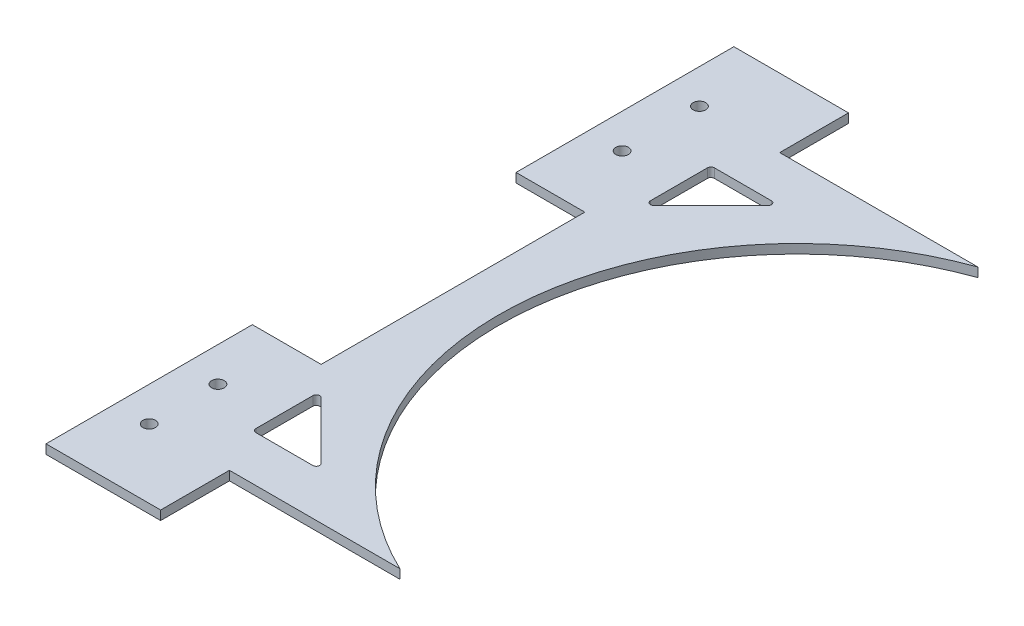
ISO-10303-21;
HEADER;
FILE_DESCRIPTION(('STEP AP214'),'2;1');
FILE_NAME('part.step','',(''),(''),'','','');
FILE_SCHEMA(('AUTOMOTIVE_DESIGN { 1 0 10303 214 1 1 1 1 }'));
ENDSEC;
DATA;
#1=APPLICATION_CONTEXT('core data for automotive mechanical design processes');
#2=APPLICATION_PROTOCOL_DEFINITION('international standard','automotive_design',2000,#1);
#3=PRODUCT_CONTEXT('',#1,'mechanical');
#4=PRODUCT('Part','Part','',(#3));
#5=PRODUCT_RELATED_PRODUCT_CATEGORY('part','',(#4));
#6=PRODUCT_DEFINITION_FORMATION('','',#4);
#7=PRODUCT_DEFINITION_CONTEXT('part definition',#1,'design');
#8=PRODUCT_DEFINITION('design','',#6,#7);
#9=PRODUCT_DEFINITION_SHAPE('','',#8);
#10=(LENGTH_UNIT() NAMED_UNIT(*) SI_UNIT(.MILLI.,.METRE.));
#11=(NAMED_UNIT(*) PLANE_ANGLE_UNIT() SI_UNIT($,.RADIAN.));
#12=(NAMED_UNIT(*) SI_UNIT($,.STERADIAN.) SOLID_ANGLE_UNIT());
#13=UNCERTAINTY_MEASURE_WITH_UNIT(LENGTH_MEASURE(1.E-05),#10,'distance_accuracy_value','');
#14=(GEOMETRIC_REPRESENTATION_CONTEXT(3) GLOBAL_UNCERTAINTY_ASSIGNED_CONTEXT((#13)) GLOBAL_UNIT_ASSIGNED_CONTEXT((#10,
#11,#12)) REPRESENTATION_CONTEXT('',''));
#15=CARTESIAN_POINT('',(0.,0.,0.));
#16=DIRECTION('',(0.,0.,1.));
#17=DIRECTION('',(1.,0.,0.));
#18=AXIS2_PLACEMENT_3D('',#15,#16,#17);
#19=CARTESIAN_POINT('',(0.,4.,0.));
#20=DIRECTION('',(0.,-1.,0.));
#21=DIRECTION('',(0.,0.,-1.));
#22=AXIS2_PLACEMENT_3D('',#19,#20,#21);
#23=PLANE('',#22);
#24=DIRECTION('',(1.,0.,0.));
#25=VECTOR('',#24,1.);
#26=CARTESIAN_POINT('',(0.,4.,270.));
#27=LINE('',#26,#25);
#28=CARTESIAN_POINT('',(50.,4.,270.));
#29=VERTEX_POINT('',#28);
#30=CARTESIAN_POINT('',(124.378511346782,4.,270.));
#31=VERTEX_POINT('',#30);
#32=EDGE_CURVE('E43',#29,#31,#27,.T.);
#33=ORIENTED_EDGE('',*,*,#32,.T.);
#34=CARTESIAN_POINT('',(180.,4.,152.5));
#35=DIRECTION('',(0.,1.,0.));
#36=DIRECTION('',(0.,0.,1.));
#37=AXIS2_PLACEMENT_3D('',#34,#35,#36);
#38=CIRCLE('',#37,130.);
#39=CARTESIAN_POINT('',(136.482762036177,4.,30.));
#40=VERTEX_POINT('',#39);
#41=EDGE_CURVE('E48',#40,#31,#38,.T.);
#42=ORIENTED_EDGE('',*,*,#41,.F.);
#43=DIRECTION('',(1.,0.,0.));
#44=VECTOR('',#43,1.);
#45=CARTESIAN_POINT('',(0.,4.,30.));
#46=LINE('',#45,#44);
#47=CARTESIAN_POINT('',(50.,4.,30.));
#48=VERTEX_POINT('',#47);
#49=EDGE_CURVE('E356',#48,#40,#46,.T.);
#50=ORIENTED_EDGE('',*,*,#49,.F.);
#51=DIRECTION('',(0.,0.,1.));
#52=VECTOR('',#51,1.);
#53=CARTESIAN_POINT('',(50.,4.,0.));
#54=LINE('',#53,#52);
#55=CARTESIAN_POINT('',(50.,4.,0.));
#56=VERTEX_POINT('',#55);
#57=EDGE_CURVE('E344',#56,#48,#54,.T.);
#58=ORIENTED_EDGE('',*,*,#57,.F.);
#59=DIRECTION('',(-1.,0.,0.));
#60=VECTOR('',#59,1.);
#61=CARTESIAN_POINT('',(0.,4.,0.));
#62=LINE('',#61,#60);
#63=CARTESIAN_POINT('',(0.,4.,0.));
#64=VERTEX_POINT('',#63);
#65=EDGE_CURVE('E340',#56,#64,#62,.T.);
#66=ORIENTED_EDGE('',*,*,#65,.T.);
#67=DIRECTION('',(0.,0.,1.));
#68=VECTOR('',#67,1.);
#69=CARTESIAN_POINT('',(0.,4.,300.));
#70=LINE('',#69,#68);
#71=CARTESIAN_POINT('',(0.,4.,95.));
#72=VERTEX_POINT('',#71);
#73=EDGE_CURVE('E336',#64,#72,#70,.T.);
#74=ORIENTED_EDGE('',*,*,#73,.T.);
#75=DIRECTION('',(1.,0.,0.));
#76=VECTOR('',#75,1.);
#77=CARTESIAN_POINT('',(0.,4.,95.));
#78=LINE('',#77,#76);
#79=CARTESIAN_POINT('',(30.,4.,95.));
#80=VERTEX_POINT('',#79);
#81=EDGE_CURVE('E339',#72,#80,#78,.T.);
#82=ORIENTED_EDGE('',*,*,#81,.T.);
#83=DIRECTION('',(0.,0.,1.));
#84=VECTOR('',#83,1.);
#85=CARTESIAN_POINT('',(30.,4.,0.));
#86=LINE('',#85,#84);
#87=CARTESIAN_POINT('',(30.,4.,210.));
#88=VERTEX_POINT('',#87);
#89=EDGE_CURVE('E379',#80,#88,#86,.T.);
#90=ORIENTED_EDGE('',*,*,#89,.T.);
#91=DIRECTION('',(-1.,0.,0.));
#92=VECTOR('',#91,1.);
#93=CARTESIAN_POINT('',(0.,4.,210.));
#94=LINE('',#93,#92);
#95=CARTESIAN_POINT('',(0.,4.,210.));
#96=VERTEX_POINT('',#95);
#97=EDGE_CURVE('E376',#88,#96,#94,.T.);
#98=ORIENTED_EDGE('',*,*,#97,.T.);
#99=CARTESIAN_POINT('',(0.,4.,300.));
#100=VERTEX_POINT('',#99);
#101=EDGE_CURVE('E341',#96,#100,#70,.T.);
#102=ORIENTED_EDGE('',*,*,#101,.T.);
#103=DIRECTION('',(1.,0.,0.));
#104=VECTOR('',#103,1.);
#105=CARTESIAN_POINT('',(360.,4.,300.));
#106=LINE('',#105,#104);
#107=CARTESIAN_POINT('',(50.,4.,300.));
#108=VERTEX_POINT('',#107);
#109=EDGE_CURVE('E394',#100,#108,#106,.T.);
#110=ORIENTED_EDGE('',*,*,#109,.T.);
#111=DIRECTION('',(0.,0.,1.));
#112=VECTOR('',#111,1.);
#113=CARTESIAN_POINT('',(50.,4.,0.));
#114=LINE('',#113,#112);
#115=EDGE_CURVE('E345',#29,#108,#114,.T.);
#116=ORIENTED_EDGE('',*,*,#115,.F.);
#117=EDGE_LOOP('',(#33,#42,#50,#58,#66,#74,#82,#90,#98,#102,#110,#116));
#118=FACE_BOUND('',#117,.T.);
#119=CARTESIAN_POINT('',(15.,4.,270.));
#120=DIRECTION('',(0.,1.,0.));
#121=DIRECTION('',(0.,0.,1.));
#122=AXIS2_PLACEMENT_3D('',#119,#120,#121);
#123=CIRCLE('',#122,2.75);
#124=CARTESIAN_POINT('',(15.,4.,272.75));
#125=VERTEX_POINT('',#124);
#126=EDGE_CURVE('E288',#125,#125,#123,.T.);
#127=ORIENTED_EDGE('',*,*,#126,.F.);
#128=EDGE_LOOP('',(#127));
#129=FACE_BOUND('',#128,.T.);
#130=CARTESIAN_POINT('',(15.,4.,240.));
#131=DIRECTION('',(0.,1.,0.));
#132=DIRECTION('',(0.,0.,1.));
#133=AXIS2_PLACEMENT_3D('',#130,#131,#132);
#134=CIRCLE('',#133,2.75);
#135=CARTESIAN_POINT('',(15.,4.,242.75));
#136=VERTEX_POINT('',#135);
#137=EDGE_CURVE('E314',#136,#136,#134,.T.);
#138=ORIENTED_EDGE('',*,*,#137,.F.);
#139=EDGE_LOOP('',(#138));
#140=FACE_BOUND('',#139,.T.);
#141=CARTESIAN_POINT('',(15.,4.,63.7440011954207));
#142=DIRECTION('',(0.,1.,0.));
#143=DIRECTION('',(0.,0.,1.));
#144=AXIS2_PLACEMENT_3D('',#141,#142,#143);
#145=CIRCLE('',#144,2.75);
#146=CARTESIAN_POINT('',(15.,4.,66.4940011954207));
#147=VERTEX_POINT('',#146);
#148=EDGE_CURVE('E308',#147,#147,#145,.T.);
#149=ORIENTED_EDGE('',*,*,#148,.F.);
#150=EDGE_LOOP('',(#149));
#151=FACE_BOUND('',#150,.T.);
#152=CARTESIAN_POINT('',(15.,4.,30.));
#153=DIRECTION('',(0.,1.,0.));
#154=DIRECTION('',(0.,0.,1.));
#155=AXIS2_PLACEMENT_3D('',#152,#153,#154);
#156=CIRCLE('',#155,2.75);
#157=CARTESIAN_POINT('',(15.,4.,32.75));
#158=VERTEX_POINT('',#157);
#159=EDGE_CURVE('E302',#158,#158,#156,.T.);
#160=ORIENTED_EDGE('',*,*,#159,.F.);
#161=EDGE_LOOP('',(#160));
#162=FACE_BOUND('',#161,.T.);
#163=DIRECTION('',(-0.707106781186547,0.,0.707106781186548));
#164=VECTOR('',#163,1.);
#165=CARTESIAN_POINT('',(60.,4.,60.));
#166=LINE('',#165,#164);
#167=CARTESIAN_POINT('',(67.4393398282201,4.,52.5606601717798));
#168=VERTEX_POINT('',#167);
#169=CARTESIAN_POINT('',(42.5606601717799,4.,77.4393398282202));
#170=VERTEX_POINT('',#169);
#171=EDGE_CURVE('E244',#168,#170,#166,.T.);
#172=ORIENTED_EDGE('',*,*,#171,.T.);
#173=CARTESIAN_POINT('',(41.5,4.,76.3786796564403));
#174=DIRECTION('',(0.,1.,0.));
#175=DIRECTION('',(0.,0.,1.));
#176=AXIS2_PLACEMENT_3D('',#173,#174,#175);
#177=CIRCLE('',#176,1.50000000000001);
#178=CARTESIAN_POINT('',(40.,4.,76.3786796564403));
#179=VERTEX_POINT('',#178);
#180=EDGE_CURVE('E255',#179,#170,#177,.T.);
#181=ORIENTED_EDGE('',*,*,#180,.F.);
#182=DIRECTION('',(0.,0.,-1.));
#183=VECTOR('',#182,1.);
#184=CARTESIAN_POINT('',(40.,4.,0.));
#185=LINE('',#184,#183);
#186=CARTESIAN_POINT('',(40.,4.,51.5));
#187=VERTEX_POINT('',#186);
#188=EDGE_CURVE('E281',#179,#187,#185,.T.);
#189=ORIENTED_EDGE('',*,*,#188,.T.);
#190=CARTESIAN_POINT('',(41.5,4.,51.5));
#191=DIRECTION('',(0.,1.,0.));
#192=DIRECTION('',(0.,0.,1.));
#193=AXIS2_PLACEMENT_3D('',#190,#191,#192);
#194=CIRCLE('',#193,1.5);
#195=CARTESIAN_POINT('',(41.5,4.,50.));
#196=VERTEX_POINT('',#195);
#197=EDGE_CURVE('E278',#196,#187,#194,.T.);
#198=ORIENTED_EDGE('',*,*,#197,.F.);
#199=DIRECTION('',(1.,0.,0.));
#200=VECTOR('',#199,1.);
#201=CARTESIAN_POINT('',(0.,4.,50.));
#202=LINE('',#201,#200);
#203=CARTESIAN_POINT('',(66.3786796564403,4.,50.));
#204=VERTEX_POINT('',#203);
#205=EDGE_CURVE('E275',#196,#204,#202,.T.);
#206=ORIENTED_EDGE('',*,*,#205,.T.);
#207=CARTESIAN_POINT('',(66.3786796564403,4.,51.5));
#208=DIRECTION('',(0.,1.,0.));
#209=DIRECTION('',(0.,0.,1.));
#210=AXIS2_PLACEMENT_3D('',#207,#208,#209);
#211=CIRCLE('',#210,1.50000000000003);
#212=EDGE_CURVE('E272',#168,#204,#211,.T.);
#213=ORIENTED_EDGE('',*,*,#212,.F.);
#214=EDGE_LOOP('',(#172,#181,#189,#198,#206,#213));
#215=FACE_BOUND('',#214,.T.);
#216=CARTESIAN_POINT('',(41.5,4.,223.62132034356));
#217=DIRECTION('',(0.,-1.,0.));
#218=DIRECTION('',(0.,0.,-1.));
#219=AXIS2_PLACEMENT_3D('',#216,#217,#218);
#220=CIRCLE('',#219,1.50000000000001);
#221=CARTESIAN_POINT('',(40.,4.,223.62132034356));
#222=VERTEX_POINT('',#221);
#223=CARTESIAN_POINT('',(42.5606601717798,4.,222.56066017178));
#224=VERTEX_POINT('',#223);
#225=EDGE_CURVE('E232',#222,#224,#220,.T.);
#226=ORIENTED_EDGE('',*,*,#225,.T.);
#227=DIRECTION('',(-0.707106781186547,0.,-0.707106781186548));
#228=VECTOR('',#227,1.);
#229=CARTESIAN_POINT('',(60.,4.,240.));
#230=LINE('',#229,#228);
#231=CARTESIAN_POINT('',(67.4393398282202,4.,247.43933982822));
#232=VERTEX_POINT('',#231);
#233=EDGE_CURVE('E56',#232,#224,#230,.T.);
#234=ORIENTED_EDGE('',*,*,#233,.F.);
#235=CARTESIAN_POINT('',(66.3786796564403,4.,248.5));
#236=DIRECTION('',(0.,-1.,0.));
#237=DIRECTION('',(0.,0.,-1.));
#238=AXIS2_PLACEMENT_3D('',#235,#236,#237);
#239=CIRCLE('',#238,1.50000000000003);
#240=CARTESIAN_POINT('',(66.3786796564403,4.,250.));
#241=VERTEX_POINT('',#240);
#242=EDGE_CURVE('E219',#232,#241,#239,.T.);
#243=ORIENTED_EDGE('',*,*,#242,.T.);
#244=DIRECTION('',(1.,0.,0.));
#245=VECTOR('',#244,1.);
#246=CARTESIAN_POINT('',(0.,4.,250.));
#247=LINE('',#246,#245);
#248=CARTESIAN_POINT('',(41.5,4.,250.));
#249=VERTEX_POINT('',#248);
#250=EDGE_CURVE('E222',#249,#241,#247,.T.);
#251=ORIENTED_EDGE('',*,*,#250,.F.);
#252=CARTESIAN_POINT('',(41.5,4.,248.5));
#253=DIRECTION('',(0.,-1.,0.));
#254=DIRECTION('',(0.,0.,-1.));
#255=AXIS2_PLACEMENT_3D('',#252,#253,#254);
#256=CIRCLE('',#255,1.5);
#257=CARTESIAN_POINT('',(40.,4.,248.5));
#258=VERTEX_POINT('',#257);
#259=EDGE_CURVE('E237',#249,#258,#256,.T.);
#260=ORIENTED_EDGE('',*,*,#259,.T.);
#261=DIRECTION('',(0.,0.,1.));
#262=VECTOR('',#261,1.);
#263=CARTESIAN_POINT('',(40.,4.,300.));
#264=LINE('',#263,#262);
#265=EDGE_CURVE('E234',#222,#258,#264,.T.);
#266=ORIENTED_EDGE('',*,*,#265,.F.);
#267=EDGE_LOOP('',(#226,#234,#243,#251,#260,#266));
#268=FACE_BOUND('',#267,.T.);
#269=ADVANCED_FACE('F40',(#118,#129,#140,#151,#162,#215,#268),#23,.F.);
#270=CARTESIAN_POINT('',(0.,0.,0.));
#271=DIRECTION('',(0.,-1.,0.));
#272=DIRECTION('',(0.,0.,-1.));
#273=AXIS2_PLACEMENT_3D('',#270,#271,#272);
#274=PLANE('',#273);
#275=CARTESIAN_POINT('',(41.5,0.,76.3786796564403));
#276=DIRECTION('',(0.,1.,0.));
#277=DIRECTION('',(0.,0.,1.));
#278=AXIS2_PLACEMENT_3D('',#275,#276,#277);
#279=CIRCLE('',#278,1.50000000000001);
#280=CARTESIAN_POINT('',(40.,0.,76.3786796564403));
#281=VERTEX_POINT('',#280);
#282=CARTESIAN_POINT('',(42.5606601717799,0.,77.4393398282202));
#283=VERTEX_POINT('',#282);
#284=EDGE_CURVE('E266',#281,#283,#279,.T.);
#285=ORIENTED_EDGE('',*,*,#284,.T.);
#286=DIRECTION('',(-0.707106781186547,0.,0.707106781186548));
#287=VECTOR('',#286,1.);
#288=CARTESIAN_POINT('',(60.,0.,60.));
#289=LINE('',#288,#287);
#290=CARTESIAN_POINT('',(67.4393398282202,0.,52.5606601717799));
#291=VERTEX_POINT('',#290);
#292=EDGE_CURVE('E252',#291,#283,#289,.T.);
#293=ORIENTED_EDGE('',*,*,#292,.F.);
#294=CARTESIAN_POINT('',(66.3786796564403,0.,51.5));
#295=DIRECTION('',(0.,1.,0.));
#296=DIRECTION('',(0.,0.,1.));
#297=AXIS2_PLACEMENT_3D('',#294,#295,#296);
#298=CIRCLE('',#297,1.50000000000003);
#299=CARTESIAN_POINT('',(66.3786796564403,0.,50.));
#300=VERTEX_POINT('',#299);
#301=EDGE_CURVE('E254',#291,#300,#298,.T.);
#302=ORIENTED_EDGE('',*,*,#301,.T.);
#303=DIRECTION('',(1.,0.,0.));
#304=VECTOR('',#303,1.);
#305=CARTESIAN_POINT('',(0.,0.,50.));
#306=LINE('',#305,#304);
#307=CARTESIAN_POINT('',(41.5,0.,50.));
#308=VERTEX_POINT('',#307);
#309=EDGE_CURVE('E258',#308,#300,#306,.T.);
#310=ORIENTED_EDGE('',*,*,#309,.F.);
#311=CARTESIAN_POINT('',(41.5,0.,51.5));
#312=DIRECTION('',(0.,1.,0.));
#313=DIRECTION('',(0.,0.,1.));
#314=AXIS2_PLACEMENT_3D('',#311,#312,#313);
#315=CIRCLE('',#314,1.5);
#316=CARTESIAN_POINT('',(40.,0.,51.5));
#317=VERTEX_POINT('',#316);
#318=EDGE_CURVE('E261',#308,#317,#315,.T.);
#319=ORIENTED_EDGE('',*,*,#318,.T.);
#320=DIRECTION('',(0.,0.,-1.));
#321=VECTOR('',#320,1.);
#322=CARTESIAN_POINT('',(40.,0.,0.));
#323=LINE('',#322,#321);
#324=EDGE_CURVE('E264',#281,#317,#323,.T.);
#325=ORIENTED_EDGE('',*,*,#324,.F.);
#326=EDGE_LOOP('',(#285,#293,#302,#310,#319,#325));
#327=FACE_BOUND('',#326,.T.);
#328=CARTESIAN_POINT('',(180.,0.,152.5));
#329=DIRECTION('',(0.,1.,0.));
#330=DIRECTION('',(0.,0.,1.));
#331=AXIS2_PLACEMENT_3D('',#328,#329,#330);
#332=CIRCLE('',#331,130.);
#333=CARTESIAN_POINT('',(136.482762036177,0.,30.));
#334=VERTEX_POINT('',#333);
#335=CARTESIAN_POINT('',(124.378511346782,0.,270.));
#336=VERTEX_POINT('',#335);
#337=EDGE_CURVE('E353',#334,#336,#332,.T.);
#338=ORIENTED_EDGE('',*,*,#337,.T.);
#339=DIRECTION('',(1.,0.,0.));
#340=VECTOR('',#339,1.);
#341=CARTESIAN_POINT('',(0.,0.,270.));
#342=LINE('',#341,#340);
#343=CARTESIAN_POINT('',(50.,0.,270.));
#344=VERTEX_POINT('',#343);
#345=EDGE_CURVE('E390',#344,#336,#342,.T.);
#346=ORIENTED_EDGE('',*,*,#345,.F.);
#347=DIRECTION('',(0.,0.,1.));
#348=VECTOR('',#347,1.);
#349=CARTESIAN_POINT('',(50.,0.,0.));
#350=LINE('',#349,#348);
#351=CARTESIAN_POINT('',(50.,0.,300.));
#352=VERTEX_POINT('',#351);
#353=EDGE_CURVE('E349',#344,#352,#350,.T.);
#354=ORIENTED_EDGE('',*,*,#353,.T.);
#355=DIRECTION('',(1.,0.,0.));
#356=VECTOR('',#355,1.);
#357=CARTESIAN_POINT('',(360.,0.,300.));
#358=LINE('',#357,#356);
#359=CARTESIAN_POINT('',(0.,0.,300.));
#360=VERTEX_POINT('',#359);
#361=EDGE_CURVE('E334',#360,#352,#358,.T.);
#362=ORIENTED_EDGE('',*,*,#361,.F.);
#363=DIRECTION('',(0.,0.,1.));
#364=VECTOR('',#363,1.);
#365=CARTESIAN_POINT('',(0.,0.,300.));
#366=LINE('',#365,#364);
#367=CARTESIAN_POINT('',(0.,0.,210.));
#368=VERTEX_POINT('',#367);
#369=EDGE_CURVE('E335',#368,#360,#366,.T.);
#370=ORIENTED_EDGE('',*,*,#369,.F.);
#371=DIRECTION('',(-1.,0.,0.));
#372=VECTOR('',#371,1.);
#373=CARTESIAN_POINT('',(0.,0.,210.));
#374=LINE('',#373,#372);
#375=CARTESIAN_POINT('',(30.,0.,210.));
#376=VERTEX_POINT('',#375);
#377=EDGE_CURVE('E372',#376,#368,#374,.T.);
#378=ORIENTED_EDGE('',*,*,#377,.F.);
#379=DIRECTION('',(0.,0.,1.));
#380=VECTOR('',#379,1.);
#381=CARTESIAN_POINT('',(30.,0.,0.));
#382=LINE('',#381,#380);
#383=CARTESIAN_POINT('',(30.,0.,95.));
#384=VERTEX_POINT('',#383);
#385=EDGE_CURVE('E359',#384,#376,#382,.T.);
#386=ORIENTED_EDGE('',*,*,#385,.F.);
#387=DIRECTION('',(1.,0.,0.));
#388=VECTOR('',#387,1.);
#389=CARTESIAN_POINT('',(0.,0.,95.));
#390=LINE('',#389,#388);
#391=CARTESIAN_POINT('',(0.,0.,95.));
#392=VERTEX_POINT('',#391);
#393=EDGE_CURVE('E367',#392,#384,#390,.T.);
#394=ORIENTED_EDGE('',*,*,#393,.F.);
#395=CARTESIAN_POINT('',(0.,0.,0.));
#396=VERTEX_POINT('',#395);
#397=EDGE_CURVE('E330',#396,#392,#366,.T.);
#398=ORIENTED_EDGE('',*,*,#397,.F.);
#399=DIRECTION('',(-1.,0.,0.));
#400=VECTOR('',#399,1.);
#401=CARTESIAN_POINT('',(0.,0.,0.));
#402=LINE('',#401,#400);
#403=CARTESIAN_POINT('',(50.,0.,0.));
#404=VERTEX_POINT('',#403);
#405=EDGE_CURVE('E325',#404,#396,#402,.T.);
#406=ORIENTED_EDGE('',*,*,#405,.F.);
#407=DIRECTION('',(0.,0.,1.));
#408=VECTOR('',#407,1.);
#409=CARTESIAN_POINT('',(50.,0.,0.));
#410=LINE('',#409,#408);
#411=CARTESIAN_POINT('',(50.,0.,30.));
#412=VERTEX_POINT('',#411);
#413=EDGE_CURVE('E352',#404,#412,#410,.T.);
#414=ORIENTED_EDGE('',*,*,#413,.T.);
#415=DIRECTION('',(1.,0.,0.));
#416=VECTOR('',#415,1.);
#417=CARTESIAN_POINT('',(0.,0.,30.));
#418=LINE('',#417,#416);
#419=EDGE_CURVE('E364',#412,#334,#418,.T.);
#420=ORIENTED_EDGE('',*,*,#419,.T.);
#421=EDGE_LOOP('',(#338,#346,#354,#362,#370,#378,#386,#394,#398,#406,#414,#420));
#422=FACE_BOUND('',#421,.T.);
#423=CARTESIAN_POINT('',(15.,0.,270.));
#424=DIRECTION('',(0.,1.,0.));
#425=DIRECTION('',(0.,0.,1.));
#426=AXIS2_PLACEMENT_3D('',#423,#424,#425);
#427=CIRCLE('',#426,2.75);
#428=CARTESIAN_POINT('',(15.,0.,272.75));
#429=VERTEX_POINT('',#428);
#430=EDGE_CURVE('E317',#429,#429,#427,.T.);
#431=ORIENTED_EDGE('',*,*,#430,.T.);
#432=EDGE_LOOP('',(#431));
#433=FACE_BOUND('',#432,.T.);
#434=CARTESIAN_POINT('',(15.,0.,240.));
#435=DIRECTION('',(0.,1.,0.));
#436=DIRECTION('',(0.,0.,1.));
#437=AXIS2_PLACEMENT_3D('',#434,#435,#436);
#438=CIRCLE('',#437,2.75);
#439=CARTESIAN_POINT('',(15.,0.,242.75));
#440=VERTEX_POINT('',#439);
#441=EDGE_CURVE('E311',#440,#440,#438,.T.);
#442=ORIENTED_EDGE('',*,*,#441,.T.);
#443=EDGE_LOOP('',(#442));
#444=FACE_BOUND('',#443,.T.);
#445=CARTESIAN_POINT('',(15.,0.,63.7440011954207));
#446=DIRECTION('',(0.,1.,0.));
#447=DIRECTION('',(0.,0.,1.));
#448=AXIS2_PLACEMENT_3D('',#445,#446,#447);
#449=CIRCLE('',#448,2.75);
#450=CARTESIAN_POINT('',(15.,0.,66.4940011954207));
#451=VERTEX_POINT('',#450);
#452=EDGE_CURVE('E305',#451,#451,#449,.T.);
#453=ORIENTED_EDGE('',*,*,#452,.T.);
#454=EDGE_LOOP('',(#453));
#455=FACE_BOUND('',#454,.T.);
#456=CARTESIAN_POINT('',(15.,0.,30.));
#457=DIRECTION('',(0.,1.,0.));
#458=DIRECTION('',(0.,0.,1.));
#459=AXIS2_PLACEMENT_3D('',#456,#457,#458);
#460=CIRCLE('',#459,2.75);
#461=CARTESIAN_POINT('',(15.,0.,32.75));
#462=VERTEX_POINT('',#461);
#463=EDGE_CURVE('E299',#462,#462,#460,.T.);
#464=ORIENTED_EDGE('',*,*,#463,.T.);
#465=EDGE_LOOP('',(#464));
#466=FACE_BOUND('',#465,.T.);
#467=DIRECTION('',(-0.707106781186547,0.,-0.707106781186548));
#468=VECTOR('',#467,1.);
#469=CARTESIAN_POINT('',(60.,0.,240.));
#470=LINE('',#469,#468);
#471=CARTESIAN_POINT('',(67.4393398282202,0.,247.43933982822));
#472=VERTEX_POINT('',#471);
#473=CARTESIAN_POINT('',(42.5606601717799,0.,222.56066017178));
#474=VERTEX_POINT('',#473);
#475=EDGE_CURVE('E210',#472,#474,#470,.T.);
#476=ORIENTED_EDGE('',*,*,#475,.T.);
#477=CARTESIAN_POINT('',(41.5,0.,223.62132034356));
#478=DIRECTION('',(0.,-1.,0.));
#479=DIRECTION('',(0.,0.,-1.));
#480=AXIS2_PLACEMENT_3D('',#477,#478,#479);
#481=CIRCLE('',#480,1.50000000000001);
#482=CARTESIAN_POINT('',(40.,0.,223.62132034356));
#483=VERTEX_POINT('',#482);
#484=EDGE_CURVE('E202',#483,#474,#481,.T.);
#485=ORIENTED_EDGE('',*,*,#484,.F.);
#486=DIRECTION('',(0.,0.,1.));
#487=VECTOR('',#486,1.);
#488=CARTESIAN_POINT('',(40.,0.,300.));
#489=LINE('',#488,#487);
#490=CARTESIAN_POINT('',(40.,0.,248.5));
#491=VERTEX_POINT('',#490);
#492=EDGE_CURVE('E64',#483,#491,#489,.T.);
#493=ORIENTED_EDGE('',*,*,#492,.T.);
#494=CARTESIAN_POINT('',(41.5,0.,248.5));
#495=DIRECTION('',(0.,-1.,0.));
#496=DIRECTION('',(0.,0.,-1.));
#497=AXIS2_PLACEMENT_3D('',#494,#495,#496);
#498=CIRCLE('',#497,1.5);
#499=CARTESIAN_POINT('',(41.5,0.,250.));
#500=VERTEX_POINT('',#499);
#501=EDGE_CURVE('E226',#500,#491,#498,.T.);
#502=ORIENTED_EDGE('',*,*,#501,.F.);
#503=DIRECTION('',(1.,0.,0.));
#504=VECTOR('',#503,1.);
#505=CARTESIAN_POINT('',(0.,0.,250.));
#506=LINE('',#505,#504);
#507=CARTESIAN_POINT('',(66.3786796564403,0.,250.));
#508=VERTEX_POINT('',#507);
#509=EDGE_CURVE('E228',#500,#508,#506,.T.);
#510=ORIENTED_EDGE('',*,*,#509,.T.);
#511=CARTESIAN_POINT('',(66.3786796564403,0.,248.5));
#512=DIRECTION('',(0.,-1.,0.));
#513=DIRECTION('',(0.,0.,-1.));
#514=AXIS2_PLACEMENT_3D('',#511,#512,#513);
#515=CIRCLE('',#514,1.50000000000003);
#516=EDGE_CURVE('E215',#472,#508,#515,.T.);
#517=ORIENTED_EDGE('',*,*,#516,.F.);
#518=EDGE_LOOP('',(#476,#485,#493,#502,#510,#517));
#519=FACE_BOUND('',#518,.T.);
#520=ADVANCED_FACE('F217',(#327,#422,#433,#444,#455,#466,#519),#274,.T.);
#521=CARTESIAN_POINT('',(0.,0.,270.));
#522=DIRECTION('',(0.,0.,1.));
#523=DIRECTION('',(1.,0.,0.));
#524=AXIS2_PLACEMENT_3D('',#521,#522,#523);
#525=PLANE('',#524);
#526=DIRECTION('',(0.,1.,0.));
#527=VECTOR('',#526,1.);
#528=CARTESIAN_POINT('',(124.378511346782,0.,270.));
#529=LINE('',#528,#527);
#530=EDGE_CURVE('E387',#336,#31,#529,.T.);
#531=ORIENTED_EDGE('',*,*,#530,.T.);
#532=ORIENTED_EDGE('',*,*,#32,.F.);
#533=DIRECTION('',(0.,1.,0.));
#534=VECTOR('',#533,1.);
#535=CARTESIAN_POINT('',(50.,0.,270.));
#536=LINE('',#535,#534);
#537=EDGE_CURVE('E342',#344,#29,#536,.T.);
#538=ORIENTED_EDGE('',*,*,#537,.F.);
#539=ORIENTED_EDGE('',*,*,#345,.T.);
#540=EDGE_LOOP('',(#531,#532,#538,#539));
#541=FACE_BOUND('',#540,.T.);
#542=ADVANCED_FACE('F407',(#541),#525,.T.);
#543=CARTESIAN_POINT('',(0.,0.,30.));
#544=DIRECTION('',(0.,0.,1.));
#545=DIRECTION('',(1.,0.,0.));
#546=AXIS2_PLACEMENT_3D('',#543,#544,#545);
#547=PLANE('',#546);
#548=ORIENTED_EDGE('',*,*,#49,.T.);
#549=DIRECTION('',(0.,1.,0.));
#550=VECTOR('',#549,1.);
#551=CARTESIAN_POINT('',(136.482762036177,0.,30.));
#552=LINE('',#551,#550);
#553=EDGE_CURVE('E11',#334,#40,#552,.T.);
#554=ORIENTED_EDGE('',*,*,#553,.F.);
#555=ORIENTED_EDGE('',*,*,#419,.F.);
#556=DIRECTION('',(0.,1.,0.));
#557=VECTOR('',#556,1.);
#558=CARTESIAN_POINT('',(50.,0.,30.));
#559=LINE('',#558,#557);
#560=EDGE_CURVE('E354',#412,#48,#559,.T.);
#561=ORIENTED_EDGE('',*,*,#560,.T.);
#562=EDGE_LOOP('',(#548,#554,#555,#561));
#563=FACE_BOUND('',#562,.T.);
#564=ADVANCED_FACE('F420',(#563),#547,.F.);
#565=CARTESIAN_POINT('',(0.,4.,300.));
#566=DIRECTION('',(1.,0.,0.));
#567=DIRECTION('',(0.,0.,-1.));
#568=AXIS2_PLACEMENT_3D('',#565,#566,#567);
#569=PLANE('',#568);
#570=DIRECTION('',(0.,1.,0.));
#571=VECTOR('',#570,1.);
#572=CARTESIAN_POINT('',(0.,0.,210.));
#573=LINE('',#572,#571);
#574=EDGE_CURVE('E370',#368,#96,#573,.T.);
#575=ORIENTED_EDGE('',*,*,#574,.F.);
#576=ORIENTED_EDGE('',*,*,#369,.T.);
#577=DIRECTION('',(0.,-1.,0.));
#578=VECTOR('',#577,1.);
#579=CARTESIAN_POINT('',(0.,4.,300.));
#580=LINE('',#579,#578);
#581=EDGE_CURVE('E322',#100,#360,#580,.T.);
#582=ORIENTED_EDGE('',*,*,#581,.F.);
#583=ORIENTED_EDGE('',*,*,#101,.F.);
#584=EDGE_LOOP('',(#575,#576,#582,#583));
#585=FACE_BOUND('',#584,.T.);
#586=ADVANCED_FACE('F438',(#585),#569,.F.);
#587=DIRECTION('',(0.,1.,0.));
#588=VECTOR('',#587,1.);
#589=CARTESIAN_POINT('',(0.,0.,95.));
#590=LINE('',#589,#588);
#591=EDGE_CURVE('E331',#392,#72,#590,.T.);
#592=ORIENTED_EDGE('',*,*,#591,.T.);
#593=ORIENTED_EDGE('',*,*,#73,.F.);
#594=DIRECTION('',(0.,-1.,0.));
#595=VECTOR('',#594,1.);
#596=CARTESIAN_POINT('',(0.,4.,0.));
#597=LINE('',#596,#595);
#598=EDGE_CURVE('E327',#64,#396,#597,.T.);
#599=ORIENTED_EDGE('',*,*,#598,.T.);
#600=ORIENTED_EDGE('',*,*,#397,.T.);
#601=EDGE_LOOP('',(#592,#593,#599,#600));
#602=FACE_BOUND('',#601,.T.);
#603=ADVANCED_FACE('F452',(#602),#569,.F.);
#604=CARTESIAN_POINT('',(360.,4.,300.));
#605=DIRECTION('',(0.,0.,-1.));
#606=DIRECTION('',(-1.,0.,0.));
#607=AXIS2_PLACEMENT_3D('',#604,#605,#606);
#608=PLANE('',#607);
#609=ORIENTED_EDGE('',*,*,#361,.T.);
#610=DIRECTION('',(0.,1.,0.));
#611=VECTOR('',#610,1.);
#612=CARTESIAN_POINT('',(50.,0.,300.));
#613=LINE('',#612,#611);
#614=EDGE_CURVE('E326',#352,#108,#613,.T.);
#615=ORIENTED_EDGE('',*,*,#614,.T.);
#616=ORIENTED_EDGE('',*,*,#109,.F.);
#617=ORIENTED_EDGE('',*,*,#581,.T.);
#618=EDGE_LOOP('',(#609,#615,#616,#617));
#619=FACE_BOUND('',#618,.T.);
#620=ADVANCED_FACE('F431',(#619),#608,.F.);
#621=CARTESIAN_POINT('',(0.,4.,0.));
#622=DIRECTION('',(0.,0.,1.));
#623=DIRECTION('',(1.,0.,0.));
#624=AXIS2_PLACEMENT_3D('',#621,#622,#623);
#625=PLANE('',#624);
#626=ORIENTED_EDGE('',*,*,#65,.F.);
#627=DIRECTION('',(0.,1.,0.));
#628=VECTOR('',#627,1.);
#629=CARTESIAN_POINT('',(50.,0.,0.));
#630=LINE('',#629,#628);
#631=EDGE_CURVE('E357',#404,#56,#630,.T.);
#632=ORIENTED_EDGE('',*,*,#631,.F.);
#633=ORIENTED_EDGE('',*,*,#405,.T.);
#634=ORIENTED_EDGE('',*,*,#598,.F.);
#635=EDGE_LOOP('',(#626,#632,#633,#634));
#636=FACE_BOUND('',#635,.T.);
#637=ADVANCED_FACE('F456',(#636),#625,.F.);
#638=CARTESIAN_POINT('',(50.,0.,0.));
#639=DIRECTION('',(-1.,0.,0.));
#640=DIRECTION('',(0.,0.,1.));
#641=AXIS2_PLACEMENT_3D('',#638,#639,#640);
#642=PLANE('',#641);
#643=ORIENTED_EDGE('',*,*,#115,.T.);
#644=ORIENTED_EDGE('',*,*,#614,.F.);
#645=ORIENTED_EDGE('',*,*,#353,.F.);
#646=ORIENTED_EDGE('',*,*,#537,.T.);
#647=EDGE_LOOP('',(#643,#644,#645,#646));
#648=FACE_BOUND('',#647,.T.);
#649=ADVANCED_FACE('F429',(#648),#642,.F.);
#650=CARTESIAN_POINT('',(50.,0.,0.));
#651=DIRECTION('',(-1.,0.,0.));
#652=DIRECTION('',(0.,0.,1.));
#653=AXIS2_PLACEMENT_3D('',#650,#651,#652);
#654=PLANE('',#653);
#655=ORIENTED_EDGE('',*,*,#57,.T.);
#656=ORIENTED_EDGE('',*,*,#560,.F.);
#657=ORIENTED_EDGE('',*,*,#413,.F.);
#658=ORIENTED_EDGE('',*,*,#631,.T.);
#659=EDGE_LOOP('',(#655,#656,#657,#658));
#660=FACE_BOUND('',#659,.T.);
#661=ADVANCED_FACE('F459',(#660),#654,.F.);
#662=CARTESIAN_POINT('',(30.,0.,0.));
#663=DIRECTION('',(-1.,0.,0.));
#664=DIRECTION('',(0.,0.,1.));
#665=AXIS2_PLACEMENT_3D('',#662,#663,#664);
#666=PLANE('',#665);
#667=ORIENTED_EDGE('',*,*,#89,.F.);
#668=DIRECTION('',(0.,1.,0.));
#669=VECTOR('',#668,1.);
#670=CARTESIAN_POINT('',(30.,0.,95.));
#671=LINE('',#670,#669);
#672=EDGE_CURVE('E365',#384,#80,#671,.T.);
#673=ORIENTED_EDGE('',*,*,#672,.F.);
#674=ORIENTED_EDGE('',*,*,#385,.T.);
#675=DIRECTION('',(0.,1.,0.));
#676=VECTOR('',#675,1.);
#677=CARTESIAN_POINT('',(30.,0.,210.));
#678=LINE('',#677,#676);
#679=EDGE_CURVE('E373',#376,#88,#678,.T.);
#680=ORIENTED_EDGE('',*,*,#679,.T.);
#681=EDGE_LOOP('',(#667,#673,#674,#680));
#682=FACE_BOUND('',#681,.T.);
#683=ADVANCED_FACE('F446',(#682),#666,.T.);
#684=CARTESIAN_POINT('',(0.,0.,210.));
#685=DIRECTION('',(0.,0.,-1.));
#686=DIRECTION('',(-1.,0.,0.));
#687=AXIS2_PLACEMENT_3D('',#684,#685,#686);
#688=PLANE('',#687);
#689=ORIENTED_EDGE('',*,*,#97,.F.);
#690=ORIENTED_EDGE('',*,*,#679,.F.);
#691=ORIENTED_EDGE('',*,*,#377,.T.);
#692=ORIENTED_EDGE('',*,*,#574,.T.);
#693=EDGE_LOOP('',(#689,#690,#691,#692));
#694=FACE_BOUND('',#693,.T.);
#695=ADVANCED_FACE('F441',(#694),#688,.T.);
#696=CARTESIAN_POINT('',(0.,0.,95.));
#697=DIRECTION('',(0.,0.,1.));
#698=DIRECTION('',(1.,0.,0.));
#699=AXIS2_PLACEMENT_3D('',#696,#697,#698);
#700=PLANE('',#699);
#701=ORIENTED_EDGE('',*,*,#81,.F.);
#702=ORIENTED_EDGE('',*,*,#591,.F.);
#703=ORIENTED_EDGE('',*,*,#393,.T.);
#704=ORIENTED_EDGE('',*,*,#672,.T.);
#705=EDGE_LOOP('',(#701,#702,#703,#704));
#706=FACE_BOUND('',#705,.T.);
#707=ADVANCED_FACE('F487',(#706),#700,.T.);
#708=CARTESIAN_POINT('',(180.,0.,152.5));
#709=DIRECTION('',(0.,1.,0.));
#710=DIRECTION('',(0.,0.,1.));
#711=AXIS2_PLACEMENT_3D('',#708,#709,#710);
#712=CYLINDRICAL_SURFACE('',#711,130.);
#713=ORIENTED_EDGE('',*,*,#41,.T.);
#714=ORIENTED_EDGE('',*,*,#530,.F.);
#715=ORIENTED_EDGE('',*,*,#337,.F.);
#716=ORIENTED_EDGE('',*,*,#553,.T.);
#717=EDGE_LOOP('',(#713,#714,#715,#716));
#718=FACE_BOUND('',#717,.T.);
#719=ADVANCED_FACE('F417',(#718),#712,.F.);
#720=CARTESIAN_POINT('',(15.,0.,270.));
#721=DIRECTION('',(0.,1.,0.));
#722=DIRECTION('',(0.,0.,1.));
#723=AXIS2_PLACEMENT_3D('',#720,#721,#722);
#724=CYLINDRICAL_SURFACE('',#723,2.75);
#725=ORIENTED_EDGE('',*,*,#430,.F.);
#726=EDGE_LOOP('',(#725));
#727=FACE_BOUND('',#726,.T.);
#728=ORIENTED_EDGE('',*,*,#126,.T.);
#729=EDGE_LOOP('',(#728));
#730=FACE_BOUND('',#729,.T.);
#731=ADVANCED_FACE('F486',(#727,#730),#724,.F.);
#732=CARTESIAN_POINT('',(15.,0.,240.));
#733=DIRECTION('',(0.,1.,0.));
#734=DIRECTION('',(0.,0.,1.));
#735=AXIS2_PLACEMENT_3D('',#732,#733,#734);
#736=CYLINDRICAL_SURFACE('',#735,2.75);
#737=ORIENTED_EDGE('',*,*,#441,.F.);
#738=EDGE_LOOP('',(#737));
#739=FACE_BOUND('',#738,.T.);
#740=ORIENTED_EDGE('',*,*,#137,.T.);
#741=EDGE_LOOP('',(#740));
#742=FACE_BOUND('',#741,.T.);
#743=ADVANCED_FACE('F505',(#739,#742),#736,.F.);
#744=CARTESIAN_POINT('',(15.,0.,63.7440011954207));
#745=DIRECTION('',(0.,1.,0.));
#746=DIRECTION('',(0.,0.,1.));
#747=AXIS2_PLACEMENT_3D('',#744,#745,#746);
#748=CYLINDRICAL_SURFACE('',#747,2.75);
#749=ORIENTED_EDGE('',*,*,#452,.F.);
#750=EDGE_LOOP('',(#749));
#751=FACE_BOUND('',#750,.T.);
#752=ORIENTED_EDGE('',*,*,#148,.T.);
#753=EDGE_LOOP('',(#752));
#754=FACE_BOUND('',#753,.T.);
#755=ADVANCED_FACE('F513',(#751,#754),#748,.F.);
#756=CARTESIAN_POINT('',(15.,0.,30.));
#757=DIRECTION('',(0.,1.,0.));
#758=DIRECTION('',(0.,0.,1.));
#759=AXIS2_PLACEMENT_3D('',#756,#757,#758);
#760=CYLINDRICAL_SURFACE('',#759,2.75);
#761=ORIENTED_EDGE('',*,*,#463,.F.);
#762=EDGE_LOOP('',(#761));
#763=FACE_BOUND('',#762,.T.);
#764=ORIENTED_EDGE('',*,*,#159,.T.);
#765=EDGE_LOOP('',(#764));
#766=FACE_BOUND('',#765,.T.);
#767=ADVANCED_FACE('F521',(#763,#766),#760,.F.);
#768=CARTESIAN_POINT('',(60.,0.,60.));
#769=DIRECTION('',(-0.707106781186548,0.,-0.707106781186547));
#770=DIRECTION('',(-0.707106781186547,0.,0.707106781186548));
#771=AXIS2_PLACEMENT_3D('',#768,#769,#770);
#772=PLANE('',#771);
#773=ORIENTED_EDGE('',*,*,#171,.F.);
#774=DIRECTION('',(0.,1.,0.));
#775=VECTOR('',#774,1.);
#776=CARTESIAN_POINT('',(67.4393398282202,0.,52.5606601717799));
#777=LINE('',#776,#775);
#778=EDGE_CURVE('E269',#291,#168,#777,.T.);
#779=ORIENTED_EDGE('',*,*,#778,.F.);
#780=ORIENTED_EDGE('',*,*,#292,.T.);
#781=DIRECTION('',(0.,1.,0.));
#782=VECTOR('',#781,1.);
#783=CARTESIAN_POINT('',(42.5606601717799,0.,77.4393398282202));
#784=LINE('',#783,#782);
#785=EDGE_CURVE('E286',#283,#170,#784,.T.);
#786=ORIENTED_EDGE('',*,*,#785,.T.);
#787=EDGE_LOOP('',(#773,#779,#780,#786));
#788=FACE_BOUND('',#787,.T.);
#789=ADVANCED_FACE('F529',(#788),#772,.T.);
#790=CARTESIAN_POINT('',(41.5,0.,76.3786796564403));
#791=DIRECTION('',(0.,1.,0.));
#792=DIRECTION('',(0.,0.,1.));
#793=AXIS2_PLACEMENT_3D('',#790,#791,#792);
#794=CYLINDRICAL_SURFACE('',#793,1.50000000000001);
#795=ORIENTED_EDGE('',*,*,#180,.T.);
#796=ORIENTED_EDGE('',*,*,#785,.F.);
#797=ORIENTED_EDGE('',*,*,#284,.F.);
#798=DIRECTION('',(0.,1.,0.));
#799=VECTOR('',#798,1.);
#800=CARTESIAN_POINT('',(40.,0.,76.3786796564403));
#801=LINE('',#800,#799);
#802=EDGE_CURVE('E289',#281,#179,#801,.T.);
#803=ORIENTED_EDGE('',*,*,#802,.T.);
#804=EDGE_LOOP('',(#795,#796,#797,#803));
#805=FACE_BOUND('',#804,.T.);
#806=ADVANCED_FACE('F537',(#805),#794,.F.);
#807=CARTESIAN_POINT('',(40.,0.,0.));
#808=DIRECTION('',(1.,0.,0.));
#809=DIRECTION('',(0.,0.,-1.));
#810=AXIS2_PLACEMENT_3D('',#807,#808,#809);
#811=PLANE('',#810);
#812=ORIENTED_EDGE('',*,*,#188,.F.);
#813=ORIENTED_EDGE('',*,*,#802,.F.);
#814=ORIENTED_EDGE('',*,*,#324,.T.);
#815=DIRECTION('',(0.,1.,0.));
#816=VECTOR('',#815,1.);
#817=CARTESIAN_POINT('',(40.,0.,51.5));
#818=LINE('',#817,#816);
#819=EDGE_CURVE('E291',#317,#187,#818,.T.);
#820=ORIENTED_EDGE('',*,*,#819,.T.);
#821=EDGE_LOOP('',(#812,#813,#814,#820));
#822=FACE_BOUND('',#821,.T.);
#823=ADVANCED_FACE('F545',(#822),#811,.T.);
#824=CARTESIAN_POINT('',(41.5,0.,51.5));
#825=DIRECTION('',(0.,1.,0.));
#826=DIRECTION('',(0.,0.,1.));
#827=AXIS2_PLACEMENT_3D('',#824,#825,#826);
#828=CYLINDRICAL_SURFACE('',#827,1.5);
#829=ORIENTED_EDGE('',*,*,#197,.T.);
#830=ORIENTED_EDGE('',*,*,#819,.F.);
#831=ORIENTED_EDGE('',*,*,#318,.F.);
#832=DIRECTION('',(0.,1.,0.));
#833=VECTOR('',#832,1.);
#834=CARTESIAN_POINT('',(41.5,0.,50.));
#835=LINE('',#834,#833);
#836=EDGE_CURVE('E293',#308,#196,#835,.T.);
#837=ORIENTED_EDGE('',*,*,#836,.T.);
#838=EDGE_LOOP('',(#829,#830,#831,#837));
#839=FACE_BOUND('',#838,.T.);
#840=ADVANCED_FACE('F553',(#839),#828,.F.);
#841=CARTESIAN_POINT('',(0.,0.,50.));
#842=DIRECTION('',(0.,0.,1.));
#843=DIRECTION('',(1.,0.,0.));
#844=AXIS2_PLACEMENT_3D('',#841,#842,#843);
#845=PLANE('',#844);
#846=ORIENTED_EDGE('',*,*,#205,.F.);
#847=ORIENTED_EDGE('',*,*,#836,.F.);
#848=ORIENTED_EDGE('',*,*,#309,.T.);
#849=DIRECTION('',(0.,1.,0.));
#850=VECTOR('',#849,1.);
#851=CARTESIAN_POINT('',(66.3786796564403,0.,50.));
#852=LINE('',#851,#850);
#853=EDGE_CURVE('E295',#300,#204,#852,.T.);
#854=ORIENTED_EDGE('',*,*,#853,.T.);
#855=EDGE_LOOP('',(#846,#847,#848,#854));
#856=FACE_BOUND('',#855,.T.);
#857=ADVANCED_FACE('F561',(#856),#845,.T.);
#858=CARTESIAN_POINT('',(66.3786796564403,0.,51.5));
#859=DIRECTION('',(0.,1.,0.));
#860=DIRECTION('',(0.,0.,1.));
#861=AXIS2_PLACEMENT_3D('',#858,#859,#860);
#862=CYLINDRICAL_SURFACE('',#861,1.50000000000003);
#863=ORIENTED_EDGE('',*,*,#212,.T.);
#864=ORIENTED_EDGE('',*,*,#853,.F.);
#865=ORIENTED_EDGE('',*,*,#301,.F.);
#866=ORIENTED_EDGE('',*,*,#778,.T.);
#867=EDGE_LOOP('',(#863,#864,#865,#866));
#868=FACE_BOUND('',#867,.T.);
#869=ADVANCED_FACE('F569',(#868),#862,.F.);
#870=CARTESIAN_POINT('',(60.,0.,240.));
#871=DIRECTION('',(0.707106781186548,0.,-0.707106781186547));
#872=DIRECTION('',(-0.707106781186547,0.,-0.707106781186548));
#873=AXIS2_PLACEMENT_3D('',#870,#871,#872);
#874=PLANE('',#873);
#875=ORIENTED_EDGE('',*,*,#233,.T.);
#876=DIRECTION('',(0.,1.,0.));
#877=VECTOR('',#876,1.);
#878=CARTESIAN_POINT('',(42.5606601717799,0.,222.56066017178));
#879=LINE('',#878,#877);
#880=EDGE_CURVE('E205',#474,#224,#879,.T.);
#881=ORIENTED_EDGE('',*,*,#880,.F.);
#882=ORIENTED_EDGE('',*,*,#475,.F.);
#883=DIRECTION('',(0.,1.,0.));
#884=VECTOR('',#883,1.);
#885=CARTESIAN_POINT('',(67.4393398282202,0.,247.43933982822));
#886=LINE('',#885,#884);
#887=EDGE_CURVE('E242',#472,#232,#886,.T.);
#888=ORIENTED_EDGE('',*,*,#887,.T.);
#889=EDGE_LOOP('',(#875,#881,#882,#888));
#890=FACE_BOUND('',#889,.T.);
#891=ADVANCED_FACE('F213',(#890),#874,.F.);
#892=CARTESIAN_POINT('',(66.3786796564403,0.,248.5));
#893=DIRECTION('',(0.,1.,0.));
#894=DIRECTION('',(0.,0.,1.));
#895=AXIS2_PLACEMENT_3D('',#892,#893,#894);
#896=CYLINDRICAL_SURFACE('',#895,1.50000000000003);
#897=ORIENTED_EDGE('',*,*,#242,.F.);
#898=ORIENTED_EDGE('',*,*,#887,.F.);
#899=ORIENTED_EDGE('',*,*,#516,.T.);
#900=DIRECTION('',(0.,1.,0.));
#901=VECTOR('',#900,1.);
#902=CARTESIAN_POINT('',(66.3786796564403,0.,250.));
#903=LINE('',#902,#901);
#904=EDGE_CURVE('E245',#508,#241,#903,.T.);
#905=ORIENTED_EDGE('',*,*,#904,.T.);
#906=EDGE_LOOP('',(#897,#898,#899,#905));
#907=FACE_BOUND('',#906,.T.);
#908=ADVANCED_FACE('F584',(#907),#896,.F.);
#909=CARTESIAN_POINT('',(0.,0.,250.));
#910=DIRECTION('',(0.,0.,1.));
#911=DIRECTION('',(1.,0.,0.));
#912=AXIS2_PLACEMENT_3D('',#909,#910,#911);
#913=PLANE('',#912);
#914=ORIENTED_EDGE('',*,*,#250,.T.);
#915=ORIENTED_EDGE('',*,*,#904,.F.);
#916=ORIENTED_EDGE('',*,*,#509,.F.);
#917=DIRECTION('',(0.,1.,0.));
#918=VECTOR('',#917,1.);
#919=CARTESIAN_POINT('',(41.5,0.,250.));
#920=LINE('',#919,#918);
#921=EDGE_CURVE('E247',#500,#249,#920,.T.);
#922=ORIENTED_EDGE('',*,*,#921,.T.);
#923=EDGE_LOOP('',(#914,#915,#916,#922));
#924=FACE_BOUND('',#923,.T.);
#925=ADVANCED_FACE('F591',(#924),#913,.F.);
#926=CARTESIAN_POINT('',(41.5,0.,248.5));
#927=DIRECTION('',(0.,1.,0.));
#928=DIRECTION('',(0.,0.,1.));
#929=AXIS2_PLACEMENT_3D('',#926,#927,#928);
#930=CYLINDRICAL_SURFACE('',#929,1.5);
#931=ORIENTED_EDGE('',*,*,#259,.F.);
#932=ORIENTED_EDGE('',*,*,#921,.F.);
#933=ORIENTED_EDGE('',*,*,#501,.T.);
#934=DIRECTION('',(0.,1.,0.));
#935=VECTOR('',#934,1.);
#936=CARTESIAN_POINT('',(40.,0.,248.5));
#937=LINE('',#936,#935);
#938=EDGE_CURVE('E249',#491,#258,#937,.T.);
#939=ORIENTED_EDGE('',*,*,#938,.T.);
#940=EDGE_LOOP('',(#931,#932,#933,#939));
#941=FACE_BOUND('',#940,.T.);
#942=ADVANCED_FACE('F599',(#941),#930,.F.);
#943=CARTESIAN_POINT('',(40.,0.,300.));
#944=DIRECTION('',(-1.,0.,0.));
#945=DIRECTION('',(0.,0.,1.));
#946=AXIS2_PLACEMENT_3D('',#943,#944,#945);
#947=PLANE('',#946);
#948=ORIENTED_EDGE('',*,*,#265,.T.);
#949=ORIENTED_EDGE('',*,*,#938,.F.);
#950=ORIENTED_EDGE('',*,*,#492,.F.);
#951=DIRECTION('',(0.,1.,0.));
#952=VECTOR('',#951,1.);
#953=CARTESIAN_POINT('',(40.,0.,223.62132034356));
#954=LINE('',#953,#952);
#955=EDGE_CURVE('E207',#483,#222,#954,.T.);
#956=ORIENTED_EDGE('',*,*,#955,.T.);
#957=EDGE_LOOP('',(#948,#949,#950,#956));
#958=FACE_BOUND('',#957,.T.);
#959=ADVANCED_FACE('F607',(#958),#947,.F.);
#960=CARTESIAN_POINT('',(41.5,0.,223.62132034356));
#961=DIRECTION('',(0.,1.,0.));
#962=DIRECTION('',(0.,0.,1.));
#963=AXIS2_PLACEMENT_3D('',#960,#961,#962);
#964=CYLINDRICAL_SURFACE('',#963,1.50000000000001);
#965=ORIENTED_EDGE('',*,*,#225,.F.);
#966=ORIENTED_EDGE('',*,*,#955,.F.);
#967=ORIENTED_EDGE('',*,*,#484,.T.);
#968=ORIENTED_EDGE('',*,*,#880,.T.);
#969=EDGE_LOOP('',(#965,#966,#967,#968));
#970=FACE_BOUND('',#969,.T.);
#971=ADVANCED_FACE('F204',(#970),#964,.F.);
#972=CLOSED_SHELL('',(#269,#520,#542,#564,#586,#603,#620,#637,#649,#661,#683,#695,#707,#719,
#731,#743,#755,#767,#789,#806,#823,#840,#857,#869,#891,#908,#925,#942,#959,#971));
#973=MANIFOLD_SOLID_BREP('B2',#972);
#974=ADVANCED_BREP_SHAPE_REPRESENTATION('',(#18,#973),#14);
#975=SHAPE_DEFINITION_REPRESENTATION(#9,#974);
ENDSEC;
END-ISO-10303-21;
